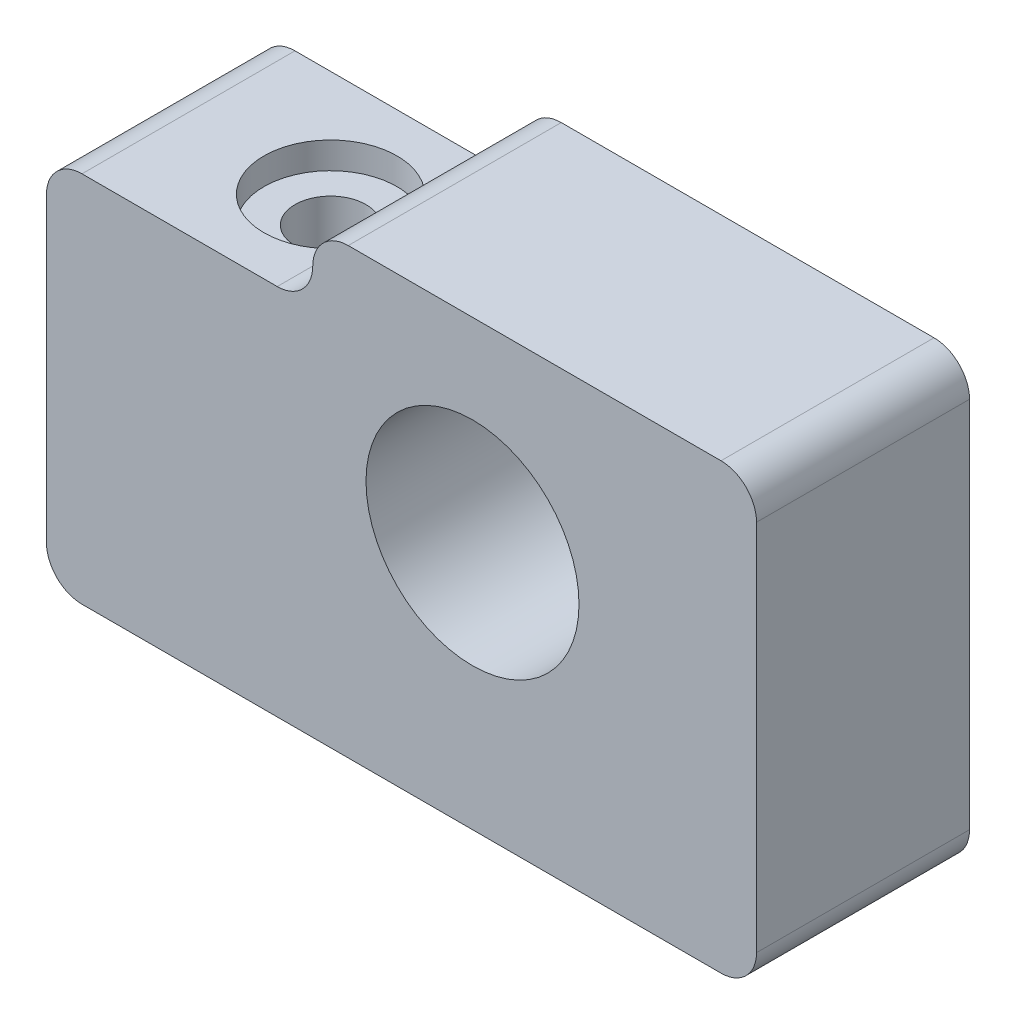
ISO-10303-21;
HEADER;
FILE_DESCRIPTION(('STEP AP214'),'2;1');
FILE_NAME('part.step','',(''),(''),'','','');
FILE_SCHEMA(('AUTOMOTIVE_DESIGN { 1 0 10303 214 1 1 1 1 }'));
ENDSEC;
DATA;
#1=APPLICATION_CONTEXT('core data for automotive mechanical design processes');
#2=APPLICATION_PROTOCOL_DEFINITION('international standard','automotive_design',2000,#1);
#3=PRODUCT_CONTEXT('',#1,'mechanical');
#4=PRODUCT('Part','Part','',(#3));
#5=PRODUCT_RELATED_PRODUCT_CATEGORY('part','',(#4));
#6=PRODUCT_DEFINITION_FORMATION('','',#4);
#7=PRODUCT_DEFINITION_CONTEXT('part definition',#1,'design');
#8=PRODUCT_DEFINITION('design','',#6,#7);
#9=PRODUCT_DEFINITION_SHAPE('','',#8);
#10=(LENGTH_UNIT() NAMED_UNIT(*) SI_UNIT(.MILLI.,.METRE.));
#11=(NAMED_UNIT(*) PLANE_ANGLE_UNIT() SI_UNIT($,.RADIAN.));
#12=(NAMED_UNIT(*) SI_UNIT($,.STERADIAN.) SOLID_ANGLE_UNIT());
#13=UNCERTAINTY_MEASURE_WITH_UNIT(LENGTH_MEASURE(1.E-05),#10,'distance_accuracy_value','');
#14=(GEOMETRIC_REPRESENTATION_CONTEXT(3) GLOBAL_UNCERTAINTY_ASSIGNED_CONTEXT((#13)) GLOBAL_UNIT_ASSIGNED_CONTEXT((#10,
#11,#12)) REPRESENTATION_CONTEXT('',''));
#15=CARTESIAN_POINT('',(0.,0.,0.));
#16=DIRECTION('',(0.,0.,1.));
#17=DIRECTION('',(1.,0.,0.));
#18=AXIS2_PLACEMENT_3D('',#15,#16,#17);
#19=CARTESIAN_POINT('',(10.,-0.001000000000001,6.));
#20=DIRECTION('',(0.,1.,0.));
#21=DIRECTION('',(0.,0.,1.));
#22=AXIS2_PLACEMENT_3D('',#19,#20,#21);
#23=CYLINDRICAL_SURFACE('',#22,2.);
#24=CARTESIAN_POINT('',(10.,0.,6.));
#25=DIRECTION('',(0.,1.,0.));
#26=DIRECTION('',(0.,0.,1.));
#27=AXIS2_PLACEMENT_3D('',#24,#25,#26);
#28=CIRCLE('',#27,2.);
#29=CARTESIAN_POINT('',(10.,0.,8.));
#30=VERTEX_POINT('',#29);
#31=EDGE_CURVE('E174',#30,#30,#28,.F.);
#32=ORIENTED_EDGE('',*,*,#31,.T.);
#33=EDGE_LOOP('',(#32));
#34=FACE_BOUND('',#33,.T.);
#35=CARTESIAN_POINT('',(10.,19.5,6.));
#36=DIRECTION('',(0.,1.,0.));
#37=DIRECTION('',(0.,0.,1.));
#38=AXIS2_PLACEMENT_3D('',#35,#36,#37);
#39=CIRCLE('',#38,2.);
#40=CARTESIAN_POINT('',(10.,19.5,8.));
#41=VERTEX_POINT('',#40);
#42=EDGE_CURVE('E178',#41,#41,#39,.F.);
#43=ORIENTED_EDGE('',*,*,#42,.F.);
#44=EDGE_LOOP('',(#43));
#45=FACE_BOUND('',#44,.T.);
#46=ADVANCED_FACE('F40',(#34,#45),#23,.F.);
#47=CARTESIAN_POINT('',(0.,0.,12.));
#48=DIRECTION('',(1.,0.,0.));
#49=DIRECTION('',(0.,0.,-1.));
#50=AXIS2_PLACEMENT_3D('',#47,#48,#49);
#51=PLANE('',#50);
#52=DIRECTION('',(0.,-1.,0.));
#53=VECTOR('',#52,1.);
#54=CARTESIAN_POINT('',(0.,0.,0.));
#55=LINE('',#54,#53);
#56=CARTESIAN_POINT('',(0.,19.,0.));
#57=VERTEX_POINT('',#56);
#58=CARTESIAN_POINT('',(0.,2.,0.));
#59=VERTEX_POINT('',#58);
#60=EDGE_CURVE('E182',#57,#59,#55,.T.);
#61=ORIENTED_EDGE('',*,*,#60,.T.);
#62=DIRECTION('',(0.,0.,-1.));
#63=VECTOR('',#62,1.);
#64=CARTESIAN_POINT('',(0.,2.,12.));
#65=LINE('',#64,#63);
#66=CARTESIAN_POINT('',(0.,2.,12.));
#67=VERTEX_POINT('',#66);
#68=EDGE_CURVE('E334',#59,#67,#65,.F.);
#69=ORIENTED_EDGE('',*,*,#68,.T.);
#70=DIRECTION('',(0.,-1.,0.));
#71=VECTOR('',#70,1.);
#72=CARTESIAN_POINT('',(0.,0.,12.));
#73=LINE('',#72,#71);
#74=CARTESIAN_POINT('',(0.,19.,12.));
#75=VERTEX_POINT('',#74);
#76=EDGE_CURVE('E185',#75,#67,#73,.T.);
#77=ORIENTED_EDGE('',*,*,#76,.F.);
#78=DIRECTION('',(0.,0.,-1.));
#79=VECTOR('',#78,1.);
#80=CARTESIAN_POINT('',(0.,19.,12.));
#81=LINE('',#80,#79);
#82=EDGE_CURVE('E336',#75,#57,#81,.T.);
#83=ORIENTED_EDGE('',*,*,#82,.T.);
#84=EDGE_LOOP('',(#61,#69,#77,#83));
#85=FACE_BOUND('',#84,.T.);
#86=ADVANCED_FACE('F233',(#85),#51,.F.);
#87=CARTESIAN_POINT('',(0.,0.,12.));
#88=DIRECTION('',(0.,1.,0.));
#89=DIRECTION('',(0.,0.,1.));
#90=AXIS2_PLACEMENT_3D('',#87,#88,#89);
#91=PLANE('',#90);
#92=ORIENTED_EDGE('',*,*,#31,.F.);
#93=EDGE_LOOP('',(#92));
#94=FACE_BOUND('',#93,.T.);
#95=DIRECTION('',(1.,0.,0.));
#96=VECTOR('',#95,1.);
#97=CARTESIAN_POINT('',(0.,0.,12.));
#98=LINE('',#97,#96);
#99=CARTESIAN_POINT('',(2.,0.,12.));
#100=VERTEX_POINT('',#99);
#101=CARTESIAN_POINT('',(38.,0.,12.));
#102=VERTEX_POINT('',#101);
#103=EDGE_CURVE('E188',#100,#102,#98,.T.);
#104=ORIENTED_EDGE('',*,*,#103,.F.);
#105=DIRECTION('',(0.,0.,-1.));
#106=VECTOR('',#105,1.);
#107=CARTESIAN_POINT('',(2.,0.,12.));
#108=LINE('',#107,#106);
#109=CARTESIAN_POINT('',(2.,0.,0.));
#110=VERTEX_POINT('',#109);
#111=EDGE_CURVE('E347',#100,#110,#108,.T.);
#112=ORIENTED_EDGE('',*,*,#111,.T.);
#113=DIRECTION('',(1.,0.,0.));
#114=VECTOR('',#113,1.);
#115=CARTESIAN_POINT('',(0.,0.,0.));
#116=LINE('',#115,#114);
#117=CARTESIAN_POINT('',(38.,0.,0.));
#118=VERTEX_POINT('',#117);
#119=EDGE_CURVE('E200',#110,#118,#116,.T.);
#120=ORIENTED_EDGE('',*,*,#119,.T.);
#121=DIRECTION('',(0.,0.,-1.));
#122=VECTOR('',#121,1.);
#123=CARTESIAN_POINT('',(38.,0.,12.));
#124=LINE('',#123,#122);
#125=EDGE_CURVE('E223',#118,#102,#124,.F.);
#126=ORIENTED_EDGE('',*,*,#125,.T.);
#127=EDGE_LOOP('',(#104,#112,#120,#126));
#128=FACE_BOUND('',#127,.T.);
#129=ADVANCED_FACE('F280',(#94,#128),#91,.F.);
#130=CARTESIAN_POINT('',(40.,21.,12.));
#131=DIRECTION('',(-1.,0.,0.));
#132=DIRECTION('',(0.,0.,1.));
#133=AXIS2_PLACEMENT_3D('',#130,#131,#132);
#134=PLANE('',#133);
#135=DIRECTION('',(0.,1.,0.));
#136=VECTOR('',#135,1.);
#137=CARTESIAN_POINT('',(40.,0.,12.));
#138=LINE('',#137,#136);
#139=CARTESIAN_POINT('',(40.,2.,12.));
#140=VERTEX_POINT('',#139);
#141=CARTESIAN_POINT('',(40.,23.,12.));
#142=VERTEX_POINT('',#141);
#143=EDGE_CURVE('E192',#140,#142,#138,.T.);
#144=ORIENTED_EDGE('',*,*,#143,.F.);
#145=DIRECTION('',(0.,0.,-1.));
#146=VECTOR('',#145,1.);
#147=CARTESIAN_POINT('',(40.,2.,12.));
#148=LINE('',#147,#146);
#149=CARTESIAN_POINT('',(40.,2.,0.));
#150=VERTEX_POINT('',#149);
#151=EDGE_CURVE('E320',#140,#150,#148,.T.);
#152=ORIENTED_EDGE('',*,*,#151,.T.);
#153=DIRECTION('',(0.,1.,0.));
#154=VECTOR('',#153,1.);
#155=CARTESIAN_POINT('',(40.,21.,0.));
#156=LINE('',#155,#154);
#157=CARTESIAN_POINT('',(40.,23.,0.));
#158=VERTEX_POINT('',#157);
#159=EDGE_CURVE('E203',#150,#158,#156,.T.);
#160=ORIENTED_EDGE('',*,*,#159,.T.);
#161=DIRECTION('',(0.,0.,-1.));
#162=VECTOR('',#161,1.);
#163=CARTESIAN_POINT('',(40.,23.,12.));
#164=LINE('',#163,#162);
#165=EDGE_CURVE('E323',#158,#142,#164,.F.);
#166=ORIENTED_EDGE('',*,*,#165,.T.);
#167=EDGE_LOOP('',(#144,#152,#160,#166));
#168=FACE_BOUND('',#167,.T.);
#169=ADVANCED_FACE('F308',(#168),#134,.F.);
#170=CARTESIAN_POINT('',(40.,25.,12.));
#171=DIRECTION('',(0.,-1.,0.));
#172=DIRECTION('',(1.,0.,0.));
#173=AXIS2_PLACEMENT_3D('',#170,#171,#172);
#174=PLANE('',#173);
#175=DIRECTION('',(-1.,0.,0.));
#176=VECTOR('',#175,1.);
#177=CARTESIAN_POINT('',(40.,25.,12.));
#178=LINE('',#177,#176);
#179=CARTESIAN_POINT('',(38.,25.,12.));
#180=VERTEX_POINT('',#179);
#181=CARTESIAN_POINT('',(17.,25.,12.));
#182=VERTEX_POINT('',#181);
#183=EDGE_CURVE('E194',#180,#182,#178,.T.);
#184=ORIENTED_EDGE('',*,*,#183,.F.);
#185=DIRECTION('',(0.,0.,-1.));
#186=VECTOR('',#185,1.);
#187=CARTESIAN_POINT('',(38.,25.,12.));
#188=LINE('',#187,#186);
#189=CARTESIAN_POINT('',(38.,25.,0.));
#190=VERTEX_POINT('',#189);
#191=EDGE_CURVE('E316',#180,#190,#188,.T.);
#192=ORIENTED_EDGE('',*,*,#191,.T.);
#193=DIRECTION('',(-1.,0.,0.));
#194=VECTOR('',#193,1.);
#195=CARTESIAN_POINT('',(40.,25.,0.));
#196=LINE('',#195,#194);
#197=CARTESIAN_POINT('',(17.,25.,0.));
#198=VERTEX_POINT('',#197);
#199=EDGE_CURVE('E206',#190,#198,#196,.T.);
#200=ORIENTED_EDGE('',*,*,#199,.T.);
#201=DIRECTION('',(0.,0.,-1.));
#202=VECTOR('',#201,1.);
#203=CARTESIAN_POINT('',(17.,25.,12.));
#204=LINE('',#203,#202);
#205=EDGE_CURVE('E57',#198,#182,#204,.F.);
#206=ORIENTED_EDGE('',*,*,#205,.T.);
#207=EDGE_LOOP('',(#184,#192,#200,#206));
#208=FACE_BOUND('',#207,.T.);
#209=ADVANCED_FACE('F303',(#208),#174,.F.);
#210=CARTESIAN_POINT('',(15.,25.,12.));
#211=DIRECTION('',(1.,0.,0.));
#212=DIRECTION('',(0.,1.,0.));
#213=AXIS2_PLACEMENT_3D('',#210,#211,#212);
#214=PLANE('',#213);
#215=DIRECTION('',(0.,0.,-1.));
#216=VECTOR('',#215,1.);
#217=CARTESIAN_POINT('',(15.,23.,12.));
#218=LINE('',#217,#216);
#219=CARTESIAN_POINT('',(15.,23.,8.24999999999999));
#220=VERTEX_POINT('',#219);
#221=CARTESIAN_POINT('',(15.,23.,3.75000000000001));
#222=VERTEX_POINT('',#221);
#223=EDGE_CURVE('E167',#220,#222,#218,.T.);
#224=ORIENTED_EDGE('',*,*,#223,.T.);
#225=CARTESIAN_POINT('',(12.4623191285821,21.,8.82833599648604));
#226=CARTESIAN_POINT('',(15.,20.3290819165751,8.60124828462769));
#227=CARTESIAN_POINT('',(15.,22.8246815151089,9.44594157363946));
#228=CARTESIAN_POINT('',(12.4991767563249,21.,8.79621773898353));
#229=CARTESIAN_POINT('',(15.,20.3801378634677,8.61201927162936));
#230=CARTESIAN_POINT('',(15.,22.855420448037,9.35516136815546));
#231=CARTESIAN_POINT('',(12.5377410441043,21.,8.76140488858078));
#232=CARTESIAN_POINT('',(15.,20.4345968460904,8.61299860321437));
#233=CARTESIAN_POINT('',(15.,22.8814810907632,9.26291726640347));
#234=CARTESIAN_POINT('',(12.6176735044653,21.,8.68576874938278));
#235=CARTESIAN_POINT('',(15.,20.5451159370826,8.5955390210271));
#236=CARTESIAN_POINT('',(15.,22.9251353119238,9.07663919568566));
#237=CARTESIAN_POINT('',(12.659035463616,21.,8.64495855808903));
#238=CARTESIAN_POINT('',(15.,20.6010803087142,8.57762773803334));
#239=CARTESIAN_POINT('',(15.,22.9427469932543,8.98260950635084));
#240=CARTESIAN_POINT('',(12.7433954353958,21.,8.55732381554121));
#241=CARTESIAN_POINT('',(15.,20.7103201218821,8.52425350378859));
#242=CARTESIAN_POINT('',(15.,22.9702815235133,8.79510316572315));
#243=CARTESIAN_POINT('',(12.7863537979161,21.,8.51061301925303));
#244=CARTESIAN_POINT('',(15.,20.7636211773799,8.48953632867678));
#245=CARTESIAN_POINT('',(15.,22.9803297213715,8.70164418628551));
#246=CARTESIAN_POINT('',(12.8738723762129,21.,8.40993976048565));
#247=CARTESIAN_POINT('',(15.,20.8661973673441,8.40461270919296));
#248=CARTESIAN_POINT('',(15.,22.9942531303239,8.51428107370783));
#249=CARTESIAN_POINT('',(12.9184327118761,21.,8.35597675444261));
#250=CARTESIAN_POINT('',(15.,20.9155658212006,8.35476720084267));
#251=CARTESIAN_POINT('',(15.,22.9981278784288,8.42037690770984));
#252=CARTESIAN_POINT('',(13.0113527826739,21.,8.23615443549321));
#253=CARTESIAN_POINT('',(15.,21.0118451084354,8.23777965526995));
#254=CARTESIAN_POINT('',(15.,23.0008881231219,8.22612640961706));
#255=CARTESIAN_POINT('',(13.0597647617103,21.,8.16973556117189));
#256=CARTESIAN_POINT('',(15.,21.0586087261181,8.16992404129083));
#257=CARTESIAN_POINT('',(15.,22.9994162672926,8.12577641417566));
#258=CARTESIAN_POINT('',(13.1561180168905,21.,8.02702524709767));
#259=CARTESIAN_POINT('',(15.,21.1447996352538,8.02107396002113));
#260=CARTESIAN_POINT('',(15.,22.9920934126659,7.92522740088892));
#261=CARTESIAN_POINT('',(13.2040591429801,21.,7.95073076336535));
#262=CARTESIAN_POINT('',(15.,21.1844323376262,7.94029394503632));
#263=CARTESIAN_POINT('',(15.,22.9862410609881,7.82502843927065));
#264=CARTESIAN_POINT('',(13.2978772392415,21.,7.78756073043685));
#265=CARTESIAN_POINT('',(15.,21.2560980550852,7.7676210445438));
#266=CARTESIAN_POINT('',(15.,22.9716341952951,7.62467448582867));
#267=CARTESIAN_POINT('',(13.3437503168271,21.,7.70066628220527));
#268=CARTESIAN_POINT('',(15.,21.288332371249,7.67579289474805));
#269=CARTESIAN_POINT('',(15.,22.9628744483062,7.52451990174379));
#270=CARTESIAN_POINT('',(13.4313255903524,21.,7.51621830587365));
#271=CARTESIAN_POINT('',(15.,21.3453004993338,7.48312339977955));
#272=CARTESIAN_POINT('',(15.,22.9440197501897,7.32434965966471));
#273=CARTESIAN_POINT('',(13.4730280311858,21.,7.4186654043275));
#274=CARTESIAN_POINT('',(15.,21.3702329406616,7.38223175469988));
#275=CARTESIAN_POINT('',(15.,22.9339248775397,7.2243339938539));
#276=CARTESIAN_POINT('',(13.5501126657648,21.,7.21296808050756));
#277=CARTESIAN_POINT('',(15.,21.4131951923233,7.1729189032659));
#278=CARTESIAN_POINT('',(15.,22.9139580405611,7.02391953711273));
#279=CARTESIAN_POINT('',(13.5854718424387,21.,7.10478720600863));
#280=CARTESIAN_POINT('',(15.,21.4313699541714,7.06427164525368));
#281=CARTESIAN_POINT('',(15.,22.904086997211,6.92352064924265));
#282=CARTESIAN_POINT('',(13.6472763656664,21.,6.87948932703387));
#283=CARTESIAN_POINT('',(15.,21.4613712426733,6.84164543384122));
#284=CARTESIAN_POINT('',(15.,22.886157429216,6.72255617463102));
#285=CARTESIAN_POINT('',(13.6737220641311,21.,6.76237267557325));
#286=CARTESIAN_POINT('',(15.,21.4733258119321,6.72733105071674));
#287=CARTESIAN_POINT('',(15.,22.8780988330185,6.62199059462817));
#288=CARTESIAN_POINT('',(13.7155010863403,21.,6.52190976394087));
#289=CARTESIAN_POINT('',(15.,21.491525566709,6.49560818298588));
#290=CARTESIAN_POINT('',(15.,22.8651296088224,6.42083819825517));
#291=CARTESIAN_POINT('',(13.7308556005997,21.,6.39857586739025));
#292=CARTESIAN_POINT('',(15.,21.4978629603787,6.37775228312334));
#293=CARTESIAN_POINT('',(15.,22.860212979951,6.32025179161874));
#294=CARTESIAN_POINT('',(13.7491298953089,21.,6.14897959024569));
#295=CARTESIAN_POINT('',(15.,21.5053179381423,6.14093879030885));
#296=CARTESIAN_POINT('',(15.,22.8543402373223,6.11896466787601));
#297=CARTESIAN_POINT('',(13.7520505831969,21.,6.02271742403726));
#298=CARTESIAN_POINT('',(15.,21.5064701809656,6.02144772357005));
#299=CARTESIAN_POINT('',(15.,22.8533838345422,6.01826395964816));
#300=CARTESIAN_POINT('',(13.7440213782355,21.,5.73143352021835));
#301=CARTESIAN_POINT('',(15.,21.5032475606468,5.74585670951359));
#302=CARTESIAN_POINT('',(15.,22.8559867478449,5.78495616009785));
#303=CARTESIAN_POINT('',(13.7283753485261,21.,5.5668278523822));
#304=CARTESIAN_POINT('',(15.,21.4969736908775,5.58913685696903));
#305=CARTESIAN_POINT('',(15.,22.8610755005832,5.65236558038833));
#306=CARTESIAN_POINT('',(13.6773940758829,21.,5.24802259770935));
#307=CARTESIAN_POINT('',(15.,21.4750084050099,5.28277110906813));
#308=CARTESIAN_POINT('',(15.,22.8769992134155,5.38745095390358));
#309=CARTESIAN_POINT('',(13.6420414982921,21.,5.0938323067191));
#310=CARTESIAN_POINT('',(15.,21.4591365933732,5.1320542770265));
#311=CARTESIAN_POINT('',(15.,22.8878392321447,5.25512724487086));
#312=CARTESIAN_POINT('',(13.55658941894,21.,4.80147934212084));
#313=CARTESIAN_POINT('',(15.,21.4166819988562,4.84167226782017));
#314=CARTESIAN_POINT('',(15.,22.9122226413042,4.99063222688122));
#315=CARTESIAN_POINT('',(13.5064766324322,21.,4.66333126395992));
#316=CARTESIAN_POINT('',(15.,21.3897792643366,4.70130879929));
#317=CARTESIAN_POINT('',(15.,22.9257684635101,4.85846116336224));
#318=CARTESIAN_POINT('',(13.3970229510249,21.,4.40550966194683));
#319=CARTESIAN_POINT('',(15.,21.3239753405662,4.43524639345031));
#320=CARTESIAN_POINT('',(15.,22.9519275490201,4.59399693721007));
#321=CARTESIAN_POINT('',(13.3376805325476,21.,4.28583919478995));
#322=CARTESIAN_POINT('',(15.,21.2846457628653,4.30927041804786));
#323=CARTESIAN_POINT('',(15.,22.9645406578489,4.46170375800925));
#324=CARTESIAN_POINT('',(13.2143563410639,21.,4.06439184739076));
#325=CARTESIAN_POINT('',(15.,21.1931130018217,4.07508067763753));
#326=CARTESIAN_POINT('',(15.,22.9852307194,4.19603576207825));
#327=CARTESIAN_POINT('',(13.1503523345683,21.,3.96270988835048));
#328=CARTESIAN_POINT('',(15.,21.1403521566993,3.96712847313092));
#329=CARTESIAN_POINT('',(15.,22.9932840751337,4.06265887777322));
#330=CARTESIAN_POINT('',(13.0220066542137,21.,3.77677552830207));
#331=CARTESIAN_POINT('',(15.,21.0228528859468,3.77430593334867));
#332=CARTESIAN_POINT('',(15.,23.0012294176644,3.79579855105697));
#333=CARTESIAN_POINT('',(12.9576656105119,21.,3.69249787298549));
#334=CARTESIAN_POINT('',(15.,20.9576477876793,3.68996030080793));
#335=CARTESIAN_POINT('',(15.,23.0011333142454,3.66231554921893));
#336=CARTESIAN_POINT('',(12.8307193628932,21.,3.53837214902901));
#337=CARTESIAN_POINT('',(15.,20.8170873547858,3.54827507058397));
#338=CARTESIAN_POINT('',(15.,22.989458254281,3.39420211298648));
#339=CARTESIAN_POINT('',(12.7681422018525,21.,3.46869898152099));
#340=CARTESIAN_POINT('',(15.,20.7412919437771,3.49223830961273));
#341=CARTESIAN_POINT('',(15.,22.9777487911535,3.25957588180633));
#342=CARTESIAN_POINT('',(12.6776201858475,21.,3.37421261492496));
#343=CARTESIAN_POINT('',(15.,20.625645758506,3.43377810652559));
#344=CARTESIAN_POINT('',(15.,22.9490737368689,3.05883802609228));
#345=CARTESIAN_POINT('',(12.6479216794576,21.,3.34431522301454));
#346=CARTESIAN_POINT('',(15.,20.5861329859516,3.41852937337915));
#347=CARTESIAN_POINT('',(15.,22.9376136926994,2.99193204489253));
#348=CARTESIAN_POINT('',(12.589866160989,21.,3.2876703837394));
#349=CARTESIAN_POINT('',(15.,20.5072443113899,3.39715930544513));
#350=CARTESIAN_POINT('',(15.,22.9106088924049,2.85889060520342));
#351=CARTESIAN_POINT('',(12.5615103884482,21.,3.26092581422927));
#352=CARTESIAN_POINT('',(15.,20.4678870308501,3.39121750647729));
#353=CARTESIAN_POINT('',(15.,22.8950604456177,2.79275589957727));
#354=CARTESIAN_POINT('',(12.5339300780515,21.,3.23563780239533));
#355=CARTESIAN_POINT('',(15.,20.429600555137,3.39012656981605));
#356=CARTESIAN_POINT('',(15.,22.8772995719642,2.72718412214698));
#357=(BOUNDED_SURFACE() B_SPLINE_SURFACE(3,2,((#225,#226,#227),(#228,#229,#230),(#231,#232,
#233),(#234,#235,#236),(#237,#238,#239),(#240,#241,#242),(#243,#244,#245),(#246,#247,#248),
(#249,#250,#251),(#252,#253,#254),(#255,#256,#257),(#258,#259,#260),(#261,#262,#263),(#264,#265,
#266),(#267,#268,#269),(#270,#271,#272),(#273,#274,#275),(#276,#277,#278),(#279,#280,#281),
(#282,#283,#284),(#285,#286,#287),(#288,#289,#290),(#291,#292,#293),(#294,#295,#296),(#297,#298,
#299),(#300,#301,#302),(#303,#304,#305),(#306,#307,#308),(#309,#310,#311),(#312,#313,#314),
(#315,#316,#317),(#318,#319,#320),(#321,#322,#323),(#324,#325,#326),(#327,#328,#329),(#330,#331,
#332),(#333,#334,#335),(#336,#337,#338),(#339,#340,#341),(#342,#343,#344),(#345,#346,#347),
(#348,#349,#350),(#351,#352,#353),(#354,#355,#356)),.UNSPECIFIED.,.F.,.F.,
.F.) B_SPLINE_SURFACE_WITH_KNOTS((4,2,2,2,2,2,2,2,2,2,2,2,2,2,2,2,2,2,2,2,2,4),(3,3),(0.,
0.287241146103718,0.573864064577754,0.855625365887266,1.13740779741272,1.43835993828268,
1.7394050641334,2.04099500147819,2.34256721948059,2.64521250919653,2.9478458488463,
3.24989944502005,3.55193099651716,3.94981538406511,4.34805031998176,4.74664478341554,
5.14530511464243,5.54601010938176,5.94612951586534,6.35079684990288,6.55432275796882,
6.75803302645844),(0.,1.),
.UNSPECIFIED.) GEOMETRIC_REPRESENTATION_ITEM() RATIONAL_B_SPLINE_SURFACE(((1.,0.604631939402414,
1.),(1.,0.612255234620357,1.),(1.,0.620080465710158,1.),(1.,0.635987716924742,1.),(1.,
0.644069148114427,1.),(1.,0.660237357021849,1.),(1.,0.668321719026476,1.),(1.,0.684495004352146,
1.),(1.,0.692583927969793,1.),(1.,0.709162496113636,1.),(1.,0.71764196536485,1.),(1.,
0.734233163323671,1.),(1.,0.742344777601262,1.),(1.,0.757977918053786,1.),(1.,0.765498349759786,
1.),(1.,0.779667645718983,1.),(1.,0.786316561153505,1.),(1.,0.798476911110358,1.),(1.,
0.803984213999055,1.),(1.,0.813536760838537,1.),(1.,0.817582062510697,1.),(1.,0.823945145426052,
1.),(1.,0.826266221170822,1.),(1.,0.829026123922203,1.),(1.,0.829465088287981,1.),(1.,
0.828255147439848,1.),(1.,0.825899423793864,1.),(1.,0.818145803821184,1.),(1.,0.812745229075447,
1.),(1.,0.799494039028251,1.),(1.,0.791641216225673,1.),(1.,0.774165218690283,1.),(1.,
0.764541751620998,1.),(1.,0.744106132628174,1.),(1.,0.733288137279719,1.),(1.,0.711073138239955,
1.),(1.,0.699677003812239,1.),(1.,0.676619658077337,1.),(1.,0.664956906124298,1.),(1.,
0.647641048003378,1.),(1.,0.641882252843538,1.),(1.,0.630475370004295,1.),(1.,0.624827387332629,
1.),(1.,0.619259654355816,1.))) REPRESENTATION_ITEM('') SURFACE());
#358=CARTESIAN_POINT('',(15.,22.8772995719642,2.72718412214698));
#359=CARTESIAN_POINT('',(15.,22.8950604456177,2.79275589957727));
#360=CARTESIAN_POINT('',(15.,22.9106088924049,2.85889060520342));
#361=CARTESIAN_POINT('',(15.,22.9376136926993,2.99193204489253));
#362=CARTESIAN_POINT('',(15.,22.9490737368689,3.05883802609228));
#363=CARTESIAN_POINT('',(15.,22.9777487911535,3.25957588180633));
#364=CARTESIAN_POINT('',(15.,22.989458254281,3.39420211298648));
#365=CARTESIAN_POINT('',(15.,23.0011333142454,3.66231554921893));
#366=CARTESIAN_POINT('',(15.,23.0012294176644,3.79579855105697));
#367=CARTESIAN_POINT('',(15.,22.9932840751337,4.06265887777322));
#368=CARTESIAN_POINT('',(15.,22.9852307194,4.19603576207825));
#369=CARTESIAN_POINT('',(15.,22.9645406578489,4.46170375800925));
#370=CARTESIAN_POINT('',(15.,22.9519275490201,4.59399693721007));
#371=CARTESIAN_POINT('',(15.,22.9257684635101,4.85846116336224));
#372=CARTESIAN_POINT('',(15.,22.9122226413042,4.99063222688122));
#373=CARTESIAN_POINT('',(15.,22.8878392321447,5.25512724487086));
#374=CARTESIAN_POINT('',(15.,22.8769992134155,5.38745095390358));
#375=CARTESIAN_POINT('',(15.,22.8610755005832,5.65236558038833));
#376=CARTESIAN_POINT('',(15.,22.8559867478449,5.78495616009785));
#377=CARTESIAN_POINT('',(15.,22.8533838345422,6.01826395964816));
#378=CARTESIAN_POINT('',(15.,22.8543402373223,6.11896466787601));
#379=CARTESIAN_POINT('',(15.,22.860212979951,6.32025179161874));
#380=CARTESIAN_POINT('',(15.,22.8651296088224,6.42083819825517));
#381=CARTESIAN_POINT('',(15.,22.8780988330185,6.62199059462817));
#382=CARTESIAN_POINT('',(15.,22.886157429216,6.72255617463102));
#383=CARTESIAN_POINT('',(15.,22.904086997211,6.92352064924265));
#384=CARTESIAN_POINT('',(15.,22.9139580405611,7.02391953711273));
#385=CARTESIAN_POINT('',(15.,22.9339248775397,7.2243339938539));
#386=CARTESIAN_POINT('',(15.,22.9440197501897,7.32434965966471));
#387=CARTESIAN_POINT('',(15.,22.9628744483062,7.52451990174379));
#388=CARTESIAN_POINT('',(15.,22.9716341952951,7.62467448582867));
#389=CARTESIAN_POINT('',(15.,22.9862410609881,7.82502843927065));
#390=CARTESIAN_POINT('',(15.,22.9920934126659,7.92522740088892));
#391=CARTESIAN_POINT('',(15.,22.9994162672926,8.12577641417566));
#392=CARTESIAN_POINT('',(15.,23.0008881231219,8.22612640961706));
#393=CARTESIAN_POINT('',(15.,22.9981278784288,8.42037690770984));
#394=CARTESIAN_POINT('',(15.,22.9942531303239,8.51428107370783));
#395=CARTESIAN_POINT('',(15.,22.9803297213715,8.70164418628551));
#396=CARTESIAN_POINT('',(15.,22.9702815235133,8.79510316572315));
#397=CARTESIAN_POINT('',(15.,22.9427469932543,8.98260950635084));
#398=CARTESIAN_POINT('',(15.,22.9251353119238,9.07663919568566));
#399=CARTESIAN_POINT('',(15.,22.8814810907632,9.26291726640347));
#400=CARTESIAN_POINT('',(15.,22.855420448037,9.35516136815546));
#401=CARTESIAN_POINT('',(15.,22.8246815151089,9.44594157363946));
#402=B_SPLINE_CURVE_WITH_KNOTS('',3,(#358,#359,#360,#361,#362,#363,#364,#365,#366,#367,#368,
#369,#370,#371,#372,#373,#374,#375,#376,#377,#378,#379,#380,#381,#382,#383,#384,#385,#386,#387,
#388,#389,#390,#391,#392,#393,#394,#395,#396,#397,#398,#399,#400,#401),.UNSPECIFIED.,.F.,.F.,(4,
2,2,2,2,2,2,2,2,2,2,2,2,2,2,2,2,2,2,2,2,4),(0.,0.203710268489626,0.407236176555562,
0.811903510593098,1.21202291707668,1.61272791181601,2.0113882430429,2.40998270647668,
2.80821764239333,3.20610202994128,3.50813358143839,3.81018717761215,4.11282051726191,
4.41546580697785,4.71703802498025,5.01862796232504,5.31967308817577,5.62062522904573,
5.90240766057117,6.18416896188069,6.47079188035472,6.75803302645844),.UNSPECIFIED.);
#403=EDGE_CURVE('E215',#222,#220,#402,.T.);
#404=ORIENTED_EDGE('',*,*,#403,.T.);
#405=EDGE_LOOP('',(#224,#404));
#406=FACE_BOUND('',#405,.T.);
#407=ADVANCED_FACE('F225',(#406),#214,.F.);
#408=CARTESIAN_POINT('',(0.,21.,12.));
#409=DIRECTION('',(0.,-1.,0.));
#410=DIRECTION('',(0.,0.,-1.));
#411=AXIS2_PLACEMENT_3D('',#408,#409,#410);
#412=PLANE('',#411);
#413=DIRECTION('',(-1.,0.,0.));
#414=VECTOR('',#413,1.);
#415=CARTESIAN_POINT('',(0.,21.,12.));
#416=LINE('',#415,#414);
#417=CARTESIAN_POINT('',(13.,21.,12.));
#418=VERTEX_POINT('',#417);
#419=CARTESIAN_POINT('',(2.,21.,12.));
#420=VERTEX_POINT('',#419);
#421=EDGE_CURVE('E166',#418,#420,#416,.T.);
#422=ORIENTED_EDGE('',*,*,#421,.F.);
#423=DIRECTION('',(0.,0.,-1.));
#424=VECTOR('',#423,1.);
#425=CARTESIAN_POINT('',(13.,21.,0.));
#426=LINE('',#425,#424);
#427=CARTESIAN_POINT('',(13.,21.,8.24999999999999));
#428=VERTEX_POINT('',#427);
#429=EDGE_CURVE('E143',#418,#428,#426,.T.);
#430=ORIENTED_EDGE('',*,*,#429,.T.);
#431=CARTESIAN_POINT('',(10.,21.,6.));
#432=DIRECTION('',(0.,1.,0.));
#433=DIRECTION('',(0.,0.,1.));
#434=AXIS2_PLACEMENT_3D('',#431,#432,#433);
#435=CIRCLE('',#434,3.75);
#436=CARTESIAN_POINT('',(13.,21.,3.75000000000001));
#437=VERTEX_POINT('',#436);
#438=EDGE_CURVE('E160',#437,#428,#435,.T.);
#439=ORIENTED_EDGE('',*,*,#438,.F.);
#440=DIRECTION('',(0.,0.,-1.));
#441=VECTOR('',#440,1.);
#442=CARTESIAN_POINT('',(13.,21.,0.));
#443=LINE('',#442,#441);
#444=CARTESIAN_POINT('',(13.,21.,0.));
#445=VERTEX_POINT('',#444);
#446=EDGE_CURVE('E168',#437,#445,#443,.T.);
#447=ORIENTED_EDGE('',*,*,#446,.T.);
#448=DIRECTION('',(-1.,0.,0.));
#449=VECTOR('',#448,1.);
#450=CARTESIAN_POINT('',(0.,21.,0.));
#451=LINE('',#450,#449);
#452=CARTESIAN_POINT('',(2.,21.,0.));
#453=VERTEX_POINT('',#452);
#454=EDGE_CURVE('E189',#445,#453,#451,.T.);
#455=ORIENTED_EDGE('',*,*,#454,.T.);
#456=DIRECTION('',(0.,0.,-1.));
#457=VECTOR('',#456,1.);
#458=CARTESIAN_POINT('',(2.,21.,12.));
#459=LINE('',#458,#457);
#460=EDGE_CURVE('E197',#453,#420,#459,.F.);
#461=ORIENTED_EDGE('',*,*,#460,.T.);
#462=EDGE_LOOP('',(#422,#430,#439,#447,#455,#461));
#463=FACE_BOUND('',#462,.T.);
#464=ADVANCED_FACE('F164',(#463),#412,.F.);
#465=CARTESIAN_POINT('',(0.,0.,12.));
#466=DIRECTION('',(0.,0.,-1.));
#467=DIRECTION('',(-1.,0.,0.));
#468=AXIS2_PLACEMENT_3D('',#465,#466,#467);
#469=PLANE('',#468);
#470=CARTESIAN_POINT('',(24.,14.,12.));
#471=DIRECTION('',(0.,0.,1.));
#472=DIRECTION('',(1.,0.,0.));
#473=AXIS2_PLACEMENT_3D('',#470,#471,#472);
#474=CIRCLE('',#473,6.);
#475=CARTESIAN_POINT('',(30.,14.,12.));
#476=VERTEX_POINT('',#475);
#477=EDGE_CURVE('E179',#476,#476,#474,.T.);
#478=ORIENTED_EDGE('',*,*,#477,.F.);
#479=EDGE_LOOP('',(#478));
#480=FACE_BOUND('',#479,.T.);
#481=ORIENTED_EDGE('',*,*,#76,.T.);
#482=CARTESIAN_POINT('',(2.,2.,12.));
#483=DIRECTION('',(0.,0.,-1.));
#484=DIRECTION('',(-1.,0.,0.));
#485=AXIS2_PLACEMENT_3D('',#482,#483,#484);
#486=CIRCLE('',#485,2.);
#487=EDGE_CURVE('E325',#67,#100,#486,.F.);
#488=ORIENTED_EDGE('',*,*,#487,.T.);
#489=ORIENTED_EDGE('',*,*,#103,.T.);
#490=CARTESIAN_POINT('',(38.,2.,12.));
#491=DIRECTION('',(0.,0.,-1.));
#492=DIRECTION('',(-1.,0.,0.));
#493=AXIS2_PLACEMENT_3D('',#490,#491,#492);
#494=CIRCLE('',#493,2.);
#495=EDGE_CURVE('E327',#102,#140,#494,.F.);
#496=ORIENTED_EDGE('',*,*,#495,.T.);
#497=ORIENTED_EDGE('',*,*,#143,.T.);
#498=CARTESIAN_POINT('',(38.,23.,12.));
#499=DIRECTION('',(0.,0.,-1.));
#500=DIRECTION('',(-1.,0.,0.));
#501=AXIS2_PLACEMENT_3D('',#498,#499,#500);
#502=CIRCLE('',#501,2.);
#503=EDGE_CURVE('E64',#142,#180,#502,.F.);
#504=ORIENTED_EDGE('',*,*,#503,.T.);
#505=ORIENTED_EDGE('',*,*,#183,.T.);
#506=CARTESIAN_POINT('',(17.,23.,12.));
#507=DIRECTION('',(0.,0.,-1.));
#508=DIRECTION('',(-1.,0.,0.));
#509=AXIS2_PLACEMENT_3D('',#506,#507,#508);
#510=CIRCLE('',#509,2.);
#511=CARTESIAN_POINT('',(15.,23.,12.));
#512=VERTEX_POINT('',#511);
#513=EDGE_CURVE('E332',#182,#512,#510,.F.);
#514=ORIENTED_EDGE('',*,*,#513,.T.);
#515=CARTESIAN_POINT('',(13.,23.,12.));
#516=DIRECTION('',(0.,0.,-1.));
#517=DIRECTION('',(-1.,0.,0.));
#518=AXIS2_PLACEMENT_3D('',#515,#516,#517);
#519=CIRCLE('',#518,2.);
#520=EDGE_CURVE('E11',#512,#418,#519,.T.);
#521=ORIENTED_EDGE('',*,*,#520,.T.);
#522=ORIENTED_EDGE('',*,*,#421,.T.);
#523=CARTESIAN_POINT('',(2.,19.,12.));
#524=DIRECTION('',(0.,0.,-1.));
#525=DIRECTION('',(-1.,0.,0.));
#526=AXIS2_PLACEMENT_3D('',#523,#524,#525);
#527=CIRCLE('',#526,2.);
#528=EDGE_CURVE('E330',#420,#75,#527,.F.);
#529=ORIENTED_EDGE('',*,*,#528,.T.);
#530=EDGE_LOOP('',(#481,#488,#489,#496,#497,#504,#505,#514,#521,#522,#529));
#531=FACE_BOUND('',#530,.T.);
#532=ADVANCED_FACE('F292',(#480,#531),#469,.F.);
#533=CARTESIAN_POINT('',(0.,0.,0.));
#534=DIRECTION('',(0.,0.,-1.));
#535=DIRECTION('',(-1.,0.,0.));
#536=AXIS2_PLACEMENT_3D('',#533,#534,#535);
#537=PLANE('',#536);
#538=CARTESIAN_POINT('',(24.,14.,0.));
#539=DIRECTION('',(0.,0.,-1.));
#540=DIRECTION('',(-1.,0.,0.));
#541=AXIS2_PLACEMENT_3D('',#538,#539,#540);
#542=CIRCLE('',#541,6.);
#543=CARTESIAN_POINT('',(18.,14.,0.));
#544=VERTEX_POINT('',#543);
#545=EDGE_CURVE('E177',#544,#544,#542,.F.);
#546=ORIENTED_EDGE('',*,*,#545,.T.);
#547=EDGE_LOOP('',(#546));
#548=FACE_BOUND('',#547,.T.);
#549=ORIENTED_EDGE('',*,*,#119,.F.);
#550=CARTESIAN_POINT('',(2.,2.,0.));
#551=DIRECTION('',(0.,0.,-1.));
#552=DIRECTION('',(-1.,0.,0.));
#553=AXIS2_PLACEMENT_3D('',#550,#551,#552);
#554=CIRCLE('',#553,2.);
#555=EDGE_CURVE('E339',#110,#59,#554,.T.);
#556=ORIENTED_EDGE('',*,*,#555,.T.);
#557=ORIENTED_EDGE('',*,*,#60,.F.);
#558=CARTESIAN_POINT('',(2.,19.,0.));
#559=DIRECTION('',(0.,0.,-1.));
#560=DIRECTION('',(-1.,0.,0.));
#561=AXIS2_PLACEMENT_3D('',#558,#559,#560);
#562=CIRCLE('',#561,2.);
#563=EDGE_CURVE('E345',#57,#453,#562,.T.);
#564=ORIENTED_EDGE('',*,*,#563,.T.);
#565=ORIENTED_EDGE('',*,*,#454,.F.);
#566=CARTESIAN_POINT('',(13.,23.,0.));
#567=DIRECTION('',(0.,0.,-1.));
#568=DIRECTION('',(-1.,0.,0.));
#569=AXIS2_PLACEMENT_3D('',#566,#567,#568);
#570=CIRCLE('',#569,2.);
#571=CARTESIAN_POINT('',(15.,23.,0.));
#572=VERTEX_POINT('',#571);
#573=EDGE_CURVE('E49',#445,#572,#570,.F.);
#574=ORIENTED_EDGE('',*,*,#573,.T.);
#575=CARTESIAN_POINT('',(17.,23.,0.));
#576=DIRECTION('',(0.,0.,-1.));
#577=DIRECTION('',(-1.,0.,0.));
#578=AXIS2_PLACEMENT_3D('',#575,#576,#577);
#579=CIRCLE('',#578,2.);
#580=EDGE_CURVE('E311',#572,#198,#579,.T.);
#581=ORIENTED_EDGE('',*,*,#580,.T.);
#582=ORIENTED_EDGE('',*,*,#199,.F.);
#583=CARTESIAN_POINT('',(38.,23.,0.));
#584=DIRECTION('',(0.,0.,-1.));
#585=DIRECTION('',(-1.,0.,0.));
#586=AXIS2_PLACEMENT_3D('',#583,#584,#585);
#587=CIRCLE('',#586,2.);
#588=EDGE_CURVE('E343',#190,#158,#587,.T.);
#589=ORIENTED_EDGE('',*,*,#588,.T.);
#590=ORIENTED_EDGE('',*,*,#159,.F.);
#591=CARTESIAN_POINT('',(38.,2.,0.));
#592=DIRECTION('',(0.,0.,-1.));
#593=DIRECTION('',(-1.,0.,0.));
#594=AXIS2_PLACEMENT_3D('',#591,#592,#593);
#595=CIRCLE('',#594,2.);
#596=EDGE_CURVE('E341',#150,#118,#595,.T.);
#597=ORIENTED_EDGE('',*,*,#596,.T.);
#598=EDGE_LOOP('',(#549,#556,#557,#564,#565,#574,#581,#582,#589,#590,#597));
#599=FACE_BOUND('',#598,.T.);
#600=ADVANCED_FACE('F290',(#548,#599),#537,.T.);
#601=CARTESIAN_POINT('',(24.,14.,-0.000999999999999265));
#602=DIRECTION('',(0.,0.,1.));
#603=DIRECTION('',(1.,0.,0.));
#604=AXIS2_PLACEMENT_3D('',#601,#602,#603);
#605=CYLINDRICAL_SURFACE('',#604,6.);
#606=ORIENTED_EDGE('',*,*,#545,.F.);
#607=EDGE_LOOP('',(#606));
#608=FACE_BOUND('',#607,.T.);
#609=ORIENTED_EDGE('',*,*,#477,.T.);
#610=EDGE_LOOP('',(#609));
#611=FACE_BOUND('',#610,.T.);
#612=ADVANCED_FACE('F286',(#608,#611),#605,.F.);
#613=CARTESIAN_POINT('',(10.,19.5,6.));
#614=DIRECTION('',(0.,1.,0.));
#615=DIRECTION('',(0.,0.,1.));
#616=AXIS2_PLACEMENT_3D('',#613,#614,#615);
#617=PLANE('',#616);
#618=CARTESIAN_POINT('',(10.,19.5,6.));
#619=DIRECTION('',(0.,1.,0.));
#620=DIRECTION('',(0.,0.,1.));
#621=AXIS2_PLACEMENT_3D('',#618,#619,#620);
#622=CIRCLE('',#621,3.75);
#623=CARTESIAN_POINT('',(10.,19.5,9.75));
#624=VERTEX_POINT('',#623);
#625=EDGE_CURVE('E159',#624,#624,#622,.T.);
#626=ORIENTED_EDGE('',*,*,#625,.T.);
#627=EDGE_LOOP('',(#626));
#628=FACE_BOUND('',#627,.T.);
#629=ORIENTED_EDGE('',*,*,#42,.T.);
#630=EDGE_LOOP('',(#629));
#631=FACE_BOUND('',#630,.T.);
#632=ADVANCED_FACE('F289',(#628,#631),#617,.T.);
#633=CARTESIAN_POINT('',(10.,19.5,6.));
#634=DIRECTION('',(0.,1.,0.));
#635=DIRECTION('',(0.,0.,1.));
#636=AXIS2_PLACEMENT_3D('',#633,#634,#635);
#637=CYLINDRICAL_SURFACE('',#636,3.75);
#638=ORIENTED_EDGE('',*,*,#625,.F.);
#639=EDGE_LOOP('',(#638));
#640=FACE_BOUND('',#639,.T.);
#641=EDGE_CURVE('E152',#428,#437,#435,.T.);
#642=ORIENTED_EDGE('',*,*,#641,.T.);
#643=ORIENTED_EDGE('',*,*,#438,.T.);
#644=EDGE_LOOP('',(#642,#643));
#645=FACE_BOUND('',#644,.T.);
#646=ADVANCED_FACE('F170',(#640,#645),#637,.F.);
#647=CARTESIAN_POINT('',(13.,23.,12.));
#648=DIRECTION('',(0.,0.,1.));
#649=DIRECTION('',(1.,0.,0.));
#650=AXIS2_PLACEMENT_3D('',#647,#648,#649);
#651=CYLINDRICAL_SURFACE('',#650,2.);
#652=CARTESIAN_POINT('',(13.,23.,3.75000000000001));
#653=DIRECTION('',(0.,0.,-1.));
#654=DIRECTION('',(-1.,0.,0.));
#655=AXIS2_PLACEMENT_3D('',#652,#653,#654);
#656=CIRCLE('',#655,2.);
#657=EDGE_CURVE('E155',#222,#437,#656,.T.);
#658=ORIENTED_EDGE('',*,*,#657,.F.);
#659=DIRECTION('',(0.,0.,-1.));
#660=VECTOR('',#659,1.);
#661=CARTESIAN_POINT('',(15.,23.,12.));
#662=LINE('',#661,#660);
#663=EDGE_CURVE('E44',#572,#222,#662,.F.);
#664=ORIENTED_EDGE('',*,*,#663,.F.);
#665=ORIENTED_EDGE('',*,*,#573,.F.);
#666=ORIENTED_EDGE('',*,*,#446,.F.);
#667=EDGE_LOOP('',(#658,#664,#665,#666));
#668=FACE_BOUND('',#667,.T.);
#669=ADVANCED_FACE('F255',(#668),#651,.F.);
#670=CARTESIAN_POINT('',(17.,23.,12.));
#671=DIRECTION('',(0.,0.,-1.));
#672=DIRECTION('',(-1.,0.,0.));
#673=AXIS2_PLACEMENT_3D('',#670,#671,#672);
#674=CYLINDRICAL_SURFACE('',#673,2.);
#675=ORIENTED_EDGE('',*,*,#663,.T.);
#676=ORIENTED_EDGE('',*,*,#223,.F.);
#677=DIRECTION('',(0.,0.,-1.));
#678=VECTOR('',#677,1.);
#679=CARTESIAN_POINT('',(15.,23.,12.));
#680=LINE('',#679,#678);
#681=EDGE_CURVE('E145',#512,#220,#680,.T.);
#682=ORIENTED_EDGE('',*,*,#681,.F.);
#683=ORIENTED_EDGE('',*,*,#513,.F.);
#684=ORIENTED_EDGE('',*,*,#205,.F.);
#685=ORIENTED_EDGE('',*,*,#580,.F.);
#686=EDGE_LOOP('',(#675,#676,#682,#683,#684,#685));
#687=FACE_BOUND('',#686,.T.);
#688=ADVANCED_FACE('F238',(#687),#674,.T.);
#689=ORIENTED_EDGE('',*,*,#657,.T.);
#690=ORIENTED_EDGE('',*,*,#641,.F.);
#691=CARTESIAN_POINT('',(13.,23.,8.24999999999999));
#692=DIRECTION('',(0.,0.,1.));
#693=DIRECTION('',(1.,0.,0.));
#694=AXIS2_PLACEMENT_3D('',#691,#692,#693);
#695=CIRCLE('',#694,2.);
#696=EDGE_CURVE('E138',#220,#428,#695,.F.);
#697=ORIENTED_EDGE('',*,*,#696,.F.);
#698=ORIENTED_EDGE('',*,*,#403,.F.);
#699=EDGE_LOOP('',(#689,#690,#697,#698));
#700=FACE_BOUND('',#699,.T.);
#701=ADVANCED_FACE('F153',(#700),#357,.F.);
#702=CARTESIAN_POINT('',(13.,23.,12.));
#703=DIRECTION('',(0.,0.,1.));
#704=DIRECTION('',(1.,0.,0.));
#705=AXIS2_PLACEMENT_3D('',#702,#703,#704);
#706=CYLINDRICAL_SURFACE('',#705,2.);
#707=ORIENTED_EDGE('',*,*,#520,.F.);
#708=ORIENTED_EDGE('',*,*,#681,.T.);
#709=ORIENTED_EDGE('',*,*,#696,.T.);
#710=ORIENTED_EDGE('',*,*,#429,.F.);
#711=EDGE_LOOP('',(#707,#708,#709,#710));
#712=FACE_BOUND('',#711,.T.);
#713=ADVANCED_FACE('F141',(#712),#706,.F.);
#714=CARTESIAN_POINT('',(2.,2.,12.));
#715=DIRECTION('',(0.,0.,-1.));
#716=DIRECTION('',(-1.,0.,0.));
#717=AXIS2_PLACEMENT_3D('',#714,#715,#716);
#718=CYLINDRICAL_SURFACE('',#717,2.);
#719=ORIENTED_EDGE('',*,*,#487,.F.);
#720=ORIENTED_EDGE('',*,*,#68,.F.);
#721=ORIENTED_EDGE('',*,*,#555,.F.);
#722=ORIENTED_EDGE('',*,*,#111,.F.);
#723=EDGE_LOOP('',(#719,#720,#721,#722));
#724=FACE_BOUND('',#723,.T.);
#725=ADVANCED_FACE('F260',(#724),#718,.T.);
#726=CARTESIAN_POINT('',(38.,2.,12.));
#727=DIRECTION('',(0.,0.,-1.));
#728=DIRECTION('',(-1.,0.,0.));
#729=AXIS2_PLACEMENT_3D('',#726,#727,#728);
#730=CYLINDRICAL_SURFACE('',#729,2.);
#731=ORIENTED_EDGE('',*,*,#495,.F.);
#732=ORIENTED_EDGE('',*,*,#125,.F.);
#733=ORIENTED_EDGE('',*,*,#596,.F.);
#734=ORIENTED_EDGE('',*,*,#151,.F.);
#735=EDGE_LOOP('',(#731,#732,#733,#734));
#736=FACE_BOUND('',#735,.T.);
#737=ADVANCED_FACE('F263',(#736),#730,.T.);
#738=CARTESIAN_POINT('',(38.,23.,12.));
#739=DIRECTION('',(0.,0.,-1.));
#740=DIRECTION('',(-1.,0.,0.));
#741=AXIS2_PLACEMENT_3D('',#738,#739,#740);
#742=CYLINDRICAL_SURFACE('',#741,2.);
#743=ORIENTED_EDGE('',*,*,#503,.F.);
#744=ORIENTED_EDGE('',*,*,#165,.F.);
#745=ORIENTED_EDGE('',*,*,#588,.F.);
#746=ORIENTED_EDGE('',*,*,#191,.F.);
#747=EDGE_LOOP('',(#743,#744,#745,#746));
#748=FACE_BOUND('',#747,.T.);
#749=ADVANCED_FACE('F266',(#748),#742,.T.);
#750=CARTESIAN_POINT('',(2.,19.,12.));
#751=DIRECTION('',(0.,0.,-1.));
#752=DIRECTION('',(-1.,0.,0.));
#753=AXIS2_PLACEMENT_3D('',#750,#751,#752);
#754=CYLINDRICAL_SURFACE('',#753,2.);
#755=ORIENTED_EDGE('',*,*,#528,.F.);
#756=ORIENTED_EDGE('',*,*,#460,.F.);
#757=ORIENTED_EDGE('',*,*,#563,.F.);
#758=ORIENTED_EDGE('',*,*,#82,.F.);
#759=EDGE_LOOP('',(#755,#756,#757,#758));
#760=FACE_BOUND('',#759,.T.);
#761=ADVANCED_FACE('F42',(#760),#754,.T.);
#762=CLOSED_SHELL('',(#46,#86,#129,#169,#209,#407,#464,#532,#600,#612,#632,#646,#669,#688,#701,
#713,#725,#737,#749,#761));
#763=MANIFOLD_SOLID_BREP('B2',#762);
#764=ADVANCED_BREP_SHAPE_REPRESENTATION('',(#18,#763),#14);
#765=SHAPE_DEFINITION_REPRESENTATION(#9,#764);
ENDSEC;
END-ISO-10303-21;
